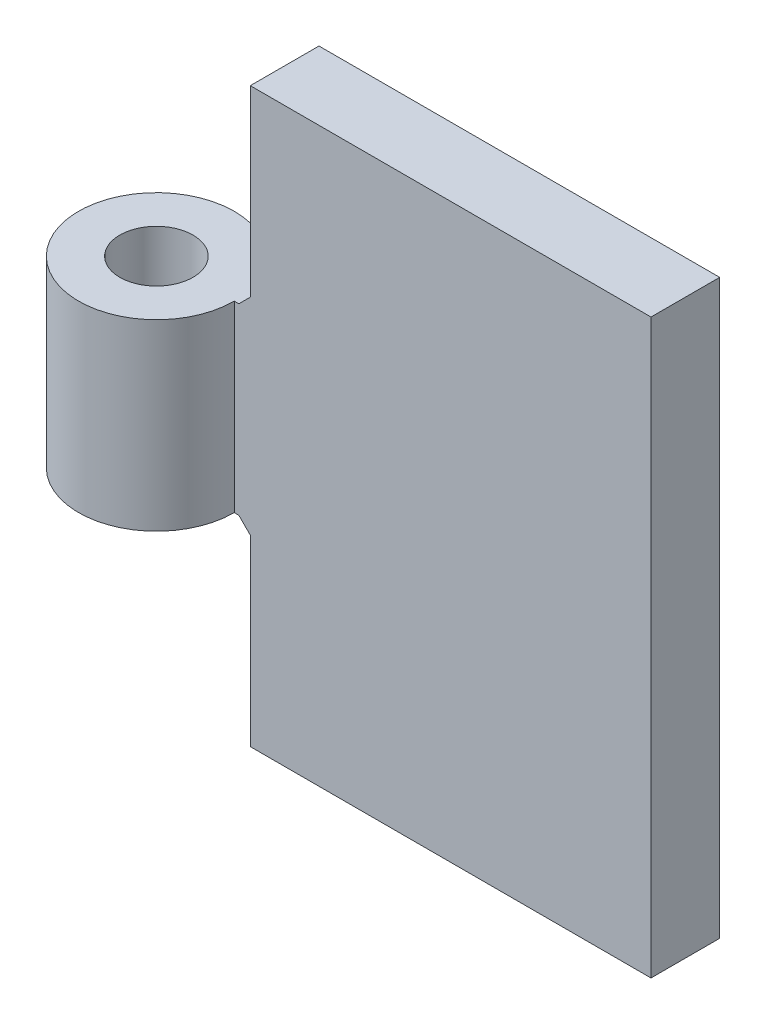
ISO-10303-21;
HEADER;
FILE_DESCRIPTION(('STEP AP214'),'2;1');
FILE_NAME('part.step','',(''),(''),'','','');
FILE_SCHEMA(('AUTOMOTIVE_DESIGN { 1 0 10303 214 1 1 1 1 }'));
ENDSEC;
DATA;
#1=APPLICATION_CONTEXT('core data for automotive mechanical design processes');
#2=APPLICATION_PROTOCOL_DEFINITION('international standard','automotive_design',2000,#1);
#3=PRODUCT_CONTEXT('',#1,'mechanical');
#4=PRODUCT('Part','Part','',(#3));
#5=PRODUCT_RELATED_PRODUCT_CATEGORY('part','',(#4));
#6=PRODUCT_DEFINITION_FORMATION('','',#4);
#7=PRODUCT_DEFINITION_CONTEXT('part definition',#1,'design');
#8=PRODUCT_DEFINITION('design','',#6,#7);
#9=PRODUCT_DEFINITION_SHAPE('','',#8);
#10=(LENGTH_UNIT() NAMED_UNIT(*) SI_UNIT(.MILLI.,.METRE.));
#11=(NAMED_UNIT(*) PLANE_ANGLE_UNIT() SI_UNIT($,.RADIAN.));
#12=(NAMED_UNIT(*) SI_UNIT($,.STERADIAN.) SOLID_ANGLE_UNIT());
#13=UNCERTAINTY_MEASURE_WITH_UNIT(LENGTH_MEASURE(1.E-05),#10,'distance_accuracy_value','');
#14=(GEOMETRIC_REPRESENTATION_CONTEXT(3) GLOBAL_UNCERTAINTY_ASSIGNED_CONTEXT((#13)) GLOBAL_UNIT_ASSIGNED_CONTEXT((#10,
#11,#12)) REPRESENTATION_CONTEXT('',''));
#15=CARTESIAN_POINT('',(0.,0.,0.));
#16=DIRECTION('',(0.,0.,1.));
#17=DIRECTION('',(1.,0.,0.));
#18=AXIS2_PLACEMENT_3D('',#15,#16,#17);
#19=CARTESIAN_POINT('',(-7.5,-4.5,3.));
#20=DIRECTION('',(0.707106781186547,0.707106781186547,0.));
#21=DIRECTION('',(0.,0.,-1.));
#22=AXIS2_PLACEMENT_3D('',#19,#20,#21);
#23=PLANE('',#22);
#24=DIRECTION('',(0.,0.,-1.));
#25=VECTOR('',#24,1.);
#26=CARTESIAN_POINT('',(-7.5,-4.5,3.));
#27=LINE('',#26,#25);
#28=CARTESIAN_POINT('',(-7.5,-4.5,3.));
#29=VERTEX_POINT('',#28);
#30=CARTESIAN_POINT('',(-7.5,-4.5,0.));
#31=VERTEX_POINT('',#30);
#32=EDGE_CURVE('E133',#29,#31,#27,.T.);
#33=ORIENTED_EDGE('',*,*,#32,.F.);
#34=DIRECTION('',(0.707106781186548,-0.707106781186548,0.));
#35=VECTOR('',#34,1.);
#36=CARTESIAN_POINT('',(-7.5,-4.5,3.));
#37=LINE('',#36,#35);
#38=CARTESIAN_POINT('',(-8.,-4.,3.));
#39=VERTEX_POINT('',#38);
#40=EDGE_CURVE('E61',#29,#39,#37,.F.);
#41=ORIENTED_EDGE('',*,*,#40,.T.);
#42=DIRECTION('',(0.,0.,1.));
#43=VECTOR('',#42,1.);
#44=CARTESIAN_POINT('',(-8.,-4.,3.));
#45=LINE('',#44,#43);
#46=CARTESIAN_POINT('',(-8.,-4.,0.));
#47=VERTEX_POINT('',#46);
#48=EDGE_CURVE('E187',#47,#39,#45,.T.);
#49=ORIENTED_EDGE('',*,*,#48,.F.);
#50=DIRECTION('',(-0.707106781186548,0.707106781186548,0.));
#51=VECTOR('',#50,1.);
#52=CARTESIAN_POINT('',(-6.,-6.,0.));
#53=LINE('',#52,#51);
#54=EDGE_CURVE('E13',#47,#31,#53,.F.);
#55=ORIENTED_EDGE('',*,*,#54,.T.);
#56=EDGE_LOOP('',(#33,#41,#49,#55));
#57=FACE_BOUND('',#56,.T.);
#58=ADVANCED_FACE('F52',(#57),#23,.F.);
#59=CARTESIAN_POINT('',(-7.5,4.5,3.));
#60=DIRECTION('',(0.707106781186547,-0.707106781186547,0.));
#61=DIRECTION('',(0.,0.,1.));
#62=AXIS2_PLACEMENT_3D('',#59,#60,#61);
#63=PLANE('',#62);
#64=DIRECTION('',(0.,0.,1.));
#65=VECTOR('',#64,1.);
#66=CARTESIAN_POINT('',(-7.5,4.5,3.));
#67=LINE('',#66,#65);
#68=CARTESIAN_POINT('',(-7.5,4.5,0.));
#69=VERTEX_POINT('',#68);
#70=CARTESIAN_POINT('',(-7.5,4.5,3.));
#71=VERTEX_POINT('',#70);
#72=EDGE_CURVE('E171',#69,#71,#67,.T.);
#73=ORIENTED_EDGE('',*,*,#72,.F.);
#74=DIRECTION('',(0.707106781186548,0.707106781186548,0.));
#75=VECTOR('',#74,1.);
#76=CARTESIAN_POINT('',(-6.,6.,0.));
#77=LINE('',#76,#75);
#78=CARTESIAN_POINT('',(-8.,4.,0.));
#79=VERTEX_POINT('',#78);
#80=EDGE_CURVE('E179',#69,#79,#77,.F.);
#81=ORIENTED_EDGE('',*,*,#80,.T.);
#82=DIRECTION('',(0.,0.,-1.));
#83=VECTOR('',#82,1.);
#84=CARTESIAN_POINT('',(-8.,4.,3.));
#85=LINE('',#84,#83);
#86=CARTESIAN_POINT('',(-8.,4.,3.));
#87=VERTEX_POINT('',#86);
#88=EDGE_CURVE('E175',#87,#79,#85,.T.);
#89=ORIENTED_EDGE('',*,*,#88,.F.);
#90=DIRECTION('',(-0.707106781186548,-0.707106781186548,0.));
#91=VECTOR('',#90,1.);
#92=CARTESIAN_POINT('',(-7.5,4.5,3.));
#93=LINE('',#92,#91);
#94=EDGE_CURVE('E182',#87,#71,#93,.F.);
#95=ORIENTED_EDGE('',*,*,#94,.T.);
#96=EDGE_LOOP('',(#73,#81,#89,#95));
#97=FACE_BOUND('',#96,.T.);
#98=ADVANCED_FACE('F269',(#97),#63,.F.);
#99=CARTESIAN_POINT('',(0.,0.,3.));
#100=DIRECTION('',(0.,0.,1.));
#101=DIRECTION('',(1.,0.,0.));
#102=AXIS2_PLACEMENT_3D('',#99,#100,#101);
#103=PLANE('',#102);
#104=ORIENTED_EDGE('',*,*,#40,.F.);
#105=DIRECTION('',(0.,-1.,0.));
#106=VECTOR('',#105,1.);
#107=CARTESIAN_POINT('',(-7.5,-0.0948751620466724,3.));
#108=LINE('',#107,#106);
#109=CARTESIAN_POINT('',(-7.5,-12.5,3.));
#110=VERTEX_POINT('',#109);
#111=EDGE_CURVE('E145',#29,#110,#108,.T.);
#112=ORIENTED_EDGE('',*,*,#111,.T.);
#113=DIRECTION('',(1.,0.,0.));
#114=VECTOR('',#113,1.);
#115=CARTESIAN_POINT('',(-10.,-12.5,3.));
#116=LINE('',#115,#114);
#117=CARTESIAN_POINT('',(10.,-12.5,3.));
#118=VERTEX_POINT('',#117);
#119=EDGE_CURVE('E143',#110,#118,#116,.T.);
#120=ORIENTED_EDGE('',*,*,#119,.T.);
#121=DIRECTION('',(0.,1.,0.));
#122=VECTOR('',#121,1.);
#123=CARTESIAN_POINT('',(10.,-12.5,3.));
#124=LINE('',#123,#122);
#125=CARTESIAN_POINT('',(10.,12.5,3.));
#126=VERTEX_POINT('',#125);
#127=EDGE_CURVE('E168',#118,#126,#124,.T.);
#128=ORIENTED_EDGE('',*,*,#127,.T.);
#129=DIRECTION('',(-1.,0.,0.));
#130=VECTOR('',#129,1.);
#131=CARTESIAN_POINT('',(-10.,12.5,3.));
#132=LINE('',#131,#130);
#133=CARTESIAN_POINT('',(-7.5,12.5,3.));
#134=VERTEX_POINT('',#133);
#135=EDGE_CURVE('E156',#126,#134,#132,.T.);
#136=ORIENTED_EDGE('',*,*,#135,.T.);
#137=DIRECTION('',(0.,1.,0.));
#138=VECTOR('',#137,1.);
#139=CARTESIAN_POINT('',(-7.5,0.0948751620466724,3.));
#140=LINE('',#139,#138);
#141=EDGE_CURVE('E233',#71,#134,#140,.T.);
#142=ORIENTED_EDGE('',*,*,#141,.F.);
#143=ORIENTED_EDGE('',*,*,#94,.F.);
#144=DIRECTION('',(-1.,0.,0.));
#145=VECTOR('',#144,1.);
#146=CARTESIAN_POINT('',(-10.,4.,3.));
#147=LINE('',#146,#145);
#148=CARTESIAN_POINT('',(-8.19999999999999,4.,3.));
#149=VERTEX_POINT('',#148);
#150=EDGE_CURVE('E226',#87,#149,#147,.T.);
#151=ORIENTED_EDGE('',*,*,#150,.T.);
#152=DIRECTION('',(0.,1.,0.));
#153=VECTOR('',#152,1.);
#154=CARTESIAN_POINT('',(-8.19999999999999,-4.,3.));
#155=LINE('',#154,#153);
#156=CARTESIAN_POINT('',(-8.19999999999999,-4.,3.));
#157=VERTEX_POINT('',#156);
#158=EDGE_CURVE('E201',#157,#149,#155,.T.);
#159=ORIENTED_EDGE('',*,*,#158,.F.);
#160=DIRECTION('',(1.,0.,0.));
#161=VECTOR('',#160,1.);
#162=CARTESIAN_POINT('',(-10.,-4.,3.));
#163=LINE('',#162,#161);
#164=EDGE_CURVE('E243',#157,#39,#163,.T.);
#165=ORIENTED_EDGE('',*,*,#164,.T.);
#166=EDGE_LOOP('',(#104,#112,#120,#128,#136,#142,#143,#151,#159,#165));
#167=FACE_BOUND('',#166,.T.);
#168=ADVANCED_FACE('F253',(#167),#103,.T.);
#169=CARTESIAN_POINT('',(-10.,-12.5,3.));
#170=DIRECTION('',(0.,1.,0.));
#171=DIRECTION('',(0.,0.,1.));
#172=AXIS2_PLACEMENT_3D('',#169,#170,#171);
#173=PLANE('',#172);
#174=DIRECTION('',(0.,0.,-1.));
#175=VECTOR('',#174,1.);
#176=CARTESIAN_POINT('',(-7.5,-12.5,3.));
#177=LINE('',#176,#175);
#178=CARTESIAN_POINT('',(-7.5,-12.5,0.));
#179=VERTEX_POINT('',#178);
#180=EDGE_CURVE('E131',#110,#179,#177,.T.);
#181=ORIENTED_EDGE('',*,*,#180,.T.);
#182=DIRECTION('',(1.,0.,0.));
#183=VECTOR('',#182,1.);
#184=CARTESIAN_POINT('',(-10.,-12.5,0.));
#185=LINE('',#184,#183);
#186=CARTESIAN_POINT('',(10.,-12.5,0.));
#187=VERTEX_POINT('',#186);
#188=EDGE_CURVE('E141',#179,#187,#185,.T.);
#189=ORIENTED_EDGE('',*,*,#188,.T.);
#190=DIRECTION('',(0.,0.,-1.));
#191=VECTOR('',#190,1.);
#192=CARTESIAN_POINT('',(10.,-12.5,3.));
#193=LINE('',#192,#191);
#194=EDGE_CURVE('E167',#118,#187,#193,.T.);
#195=ORIENTED_EDGE('',*,*,#194,.F.);
#196=ORIENTED_EDGE('',*,*,#119,.F.);
#197=EDGE_LOOP('',(#181,#189,#195,#196));
#198=FACE_BOUND('',#197,.T.);
#199=ADVANCED_FACE('F139',(#198),#173,.F.);
#200=CARTESIAN_POINT('',(0.,0.,0.));
#201=DIRECTION('',(0.,0.,1.));
#202=DIRECTION('',(1.,0.,0.));
#203=AXIS2_PLACEMENT_3D('',#200,#201,#202);
#204=PLANE('',#203);
#205=ORIENTED_EDGE('',*,*,#54,.F.);
#206=DIRECTION('',(-1.,0.,0.));
#207=VECTOR('',#206,1.);
#208=CARTESIAN_POINT('',(-10.,-4.,0.));
#209=LINE('',#208,#207);
#210=CARTESIAN_POINT('',(-10.,-4.,0.));
#211=VERTEX_POINT('',#210);
#212=EDGE_CURVE('E136',#47,#211,#209,.T.);
#213=ORIENTED_EDGE('',*,*,#212,.T.);
#214=DIRECTION('',(0.,-1.,0.));
#215=VECTOR('',#214,1.);
#216=CARTESIAN_POINT('',(-10.,-12.5,0.));
#217=LINE('',#216,#215);
#218=CARTESIAN_POINT('',(-10.,4.,0.));
#219=VERTEX_POINT('',#218);
#220=EDGE_CURVE('E152',#219,#211,#217,.T.);
#221=ORIENTED_EDGE('',*,*,#220,.F.);
#222=DIRECTION('',(1.,0.,0.));
#223=VECTOR('',#222,1.);
#224=CARTESIAN_POINT('',(-10.,4.,0.));
#225=LINE('',#224,#223);
#226=EDGE_CURVE('E232',#219,#79,#225,.T.);
#227=ORIENTED_EDGE('',*,*,#226,.T.);
#228=ORIENTED_EDGE('',*,*,#80,.F.);
#229=DIRECTION('',(0.,1.,0.));
#230=VECTOR('',#229,1.);
#231=CARTESIAN_POINT('',(-7.5,0.0948751620466724,0.));
#232=LINE('',#231,#230);
#233=CARTESIAN_POINT('',(-7.5,12.5,0.));
#234=VERTEX_POINT('',#233);
#235=EDGE_CURVE('E236',#69,#234,#232,.T.);
#236=ORIENTED_EDGE('',*,*,#235,.T.);
#237=DIRECTION('',(-1.,0.,0.));
#238=VECTOR('',#237,1.);
#239=CARTESIAN_POINT('',(-10.,12.5,0.));
#240=LINE('',#239,#238);
#241=CARTESIAN_POINT('',(10.,12.5,0.));
#242=VERTEX_POINT('',#241);
#243=EDGE_CURVE('E159',#242,#234,#240,.T.);
#244=ORIENTED_EDGE('',*,*,#243,.F.);
#245=DIRECTION('',(0.,1.,0.));
#246=VECTOR('',#245,1.);
#247=CARTESIAN_POINT('',(10.,-12.5,0.));
#248=LINE('',#247,#246);
#249=EDGE_CURVE('E150',#187,#242,#248,.T.);
#250=ORIENTED_EDGE('',*,*,#249,.F.);
#251=ORIENTED_EDGE('',*,*,#188,.F.);
#252=DIRECTION('',(0.,-1.,0.));
#253=VECTOR('',#252,1.);
#254=CARTESIAN_POINT('',(-7.5,-0.0948751620466724,0.));
#255=LINE('',#254,#253);
#256=EDGE_CURVE('E127',#31,#179,#255,.T.);
#257=ORIENTED_EDGE('',*,*,#256,.F.);
#258=EDGE_LOOP('',(#205,#213,#221,#227,#228,#236,#244,#250,#251,#257));
#259=FACE_BOUND('',#258,.T.);
#260=ADVANCED_FACE('F148',(#259),#204,.F.);
#261=CARTESIAN_POINT('',(-10.,12.5,3.));
#262=DIRECTION('',(0.,-1.,0.));
#263=DIRECTION('',(0.,0.,-1.));
#264=AXIS2_PLACEMENT_3D('',#261,#262,#263);
#265=PLANE('',#264);
#266=ORIENTED_EDGE('',*,*,#243,.T.);
#267=DIRECTION('',(0.,0.,-1.));
#268=VECTOR('',#267,1.);
#269=CARTESIAN_POINT('',(-7.5,12.5,3.));
#270=LINE('',#269,#268);
#271=EDGE_CURVE('E237',#134,#234,#270,.T.);
#272=ORIENTED_EDGE('',*,*,#271,.F.);
#273=ORIENTED_EDGE('',*,*,#135,.F.);
#274=DIRECTION('',(0.,0.,-1.));
#275=VECTOR('',#274,1.);
#276=CARTESIAN_POINT('',(10.,12.5,3.));
#277=LINE('',#276,#275);
#278=EDGE_CURVE('E163',#126,#242,#277,.T.);
#279=ORIENTED_EDGE('',*,*,#278,.T.);
#280=EDGE_LOOP('',(#266,#272,#273,#279));
#281=FACE_BOUND('',#280,.T.);
#282=ADVANCED_FACE('F261',(#281),#265,.F.);
#283=CARTESIAN_POINT('',(10.,-12.5,3.));
#284=DIRECTION('',(-1.,0.,0.));
#285=DIRECTION('',(0.,0.,1.));
#286=AXIS2_PLACEMENT_3D('',#283,#284,#285);
#287=PLANE('',#286);
#288=ORIENTED_EDGE('',*,*,#249,.T.);
#289=ORIENTED_EDGE('',*,*,#278,.F.);
#290=ORIENTED_EDGE('',*,*,#127,.F.);
#291=ORIENTED_EDGE('',*,*,#194,.T.);
#292=EDGE_LOOP('',(#288,#289,#290,#291));
#293=FACE_BOUND('',#292,.T.);
#294=ADVANCED_FACE('F260',(#293),#287,.F.);
#295=CARTESIAN_POINT('',(-11.6,-4.,3.));
#296=DIRECTION('',(0.,1.,0.));
#297=DIRECTION('',(0.,0.,1.));
#298=AXIS2_PLACEMENT_3D('',#295,#296,#297);
#299=PLANE('',#298);
#300=CARTESIAN_POINT('',(-11.6,-4.,3.));
#301=DIRECTION('',(0.,1.,0.));
#302=DIRECTION('',(0.,0.,1.));
#303=AXIS2_PLACEMENT_3D('',#300,#301,#302);
#304=CIRCLE('',#303,1.60000000000001);
#305=CARTESIAN_POINT('',(-11.6,-4.,4.6));
#306=VERTEX_POINT('',#305);
#307=EDGE_CURVE('E220',#306,#306,#304,.T.);
#308=ORIENTED_EDGE('',*,*,#307,.T.);
#309=EDGE_LOOP('',(#308));
#310=FACE_BOUND('',#309,.T.);
#311=ORIENTED_EDGE('',*,*,#212,.F.);
#312=ORIENTED_EDGE('',*,*,#48,.T.);
#313=ORIENTED_EDGE('',*,*,#164,.F.);
#314=CARTESIAN_POINT('',(-11.6,-4.,3.));
#315=DIRECTION('',(0.,1.,0.));
#316=DIRECTION('',(0.,0.,1.));
#317=AXIS2_PLACEMENT_3D('',#314,#315,#316);
#318=CIRCLE('',#317,3.4);
#319=EDGE_CURVE('E209',#211,#157,#318,.T.);
#320=ORIENTED_EDGE('',*,*,#319,.F.);
#321=EDGE_LOOP('',(#311,#312,#313,#320));
#322=FACE_BOUND('',#321,.T.);
#323=ADVANCED_FACE('F256',(#310,#322),#299,.F.);
#324=CARTESIAN_POINT('',(-11.6,4.,3.));
#325=DIRECTION('',(0.,1.,0.));
#326=DIRECTION('',(0.,0.,1.));
#327=AXIS2_PLACEMENT_3D('',#324,#325,#326);
#328=PLANE('',#327);
#329=CARTESIAN_POINT('',(-11.6,4.,3.));
#330=DIRECTION('',(0.,1.,0.));
#331=DIRECTION('',(0.,0.,1.));
#332=AXIS2_PLACEMENT_3D('',#329,#330,#331);
#333=CIRCLE('',#332,1.60000000000001);
#334=CARTESIAN_POINT('',(-11.6,4.,4.6));
#335=VERTEX_POINT('',#334);
#336=EDGE_CURVE('E222',#335,#335,#333,.T.);
#337=ORIENTED_EDGE('',*,*,#336,.F.);
#338=EDGE_LOOP('',(#337));
#339=FACE_BOUND('',#338,.T.);
#340=ORIENTED_EDGE('',*,*,#150,.F.);
#341=ORIENTED_EDGE('',*,*,#88,.T.);
#342=ORIENTED_EDGE('',*,*,#226,.F.);
#343=CARTESIAN_POINT('',(-11.6,4.,3.));
#344=DIRECTION('',(0.,1.,0.));
#345=DIRECTION('',(0.,0.,1.));
#346=AXIS2_PLACEMENT_3D('',#343,#344,#345);
#347=CIRCLE('',#346,3.4);
#348=EDGE_CURVE('E216',#219,#149,#347,.T.);
#349=ORIENTED_EDGE('',*,*,#348,.T.);
#350=EDGE_LOOP('',(#340,#341,#342,#349));
#351=FACE_BOUND('',#350,.T.);
#352=ADVANCED_FACE('F271',(#339,#351),#328,.T.);
#353=CARTESIAN_POINT('',(-11.6,-4.,3.));
#354=DIRECTION('',(0.,1.,0.));
#355=DIRECTION('',(0.,0.,1.));
#356=AXIS2_PLACEMENT_3D('',#353,#354,#355);
#357=CYLINDRICAL_SURFACE('',#356,3.4);
#358=ORIENTED_EDGE('',*,*,#319,.T.);
#359=ORIENTED_EDGE('',*,*,#158,.T.);
#360=ORIENTED_EDGE('',*,*,#348,.F.);
#361=ORIENTED_EDGE('',*,*,#220,.T.);
#362=EDGE_LOOP('',(#358,#359,#360,#361));
#363=FACE_BOUND('',#362,.T.);
#364=ADVANCED_FACE('F273',(#363),#357,.T.);
#365=CARTESIAN_POINT('',(-11.6,-4.,3.));
#366=DIRECTION('',(0.,1.,0.));
#367=DIRECTION('',(0.,0.,1.));
#368=AXIS2_PLACEMENT_3D('',#365,#366,#367);
#369=CYLINDRICAL_SURFACE('',#368,1.60000000000001);
#370=ORIENTED_EDGE('',*,*,#336,.T.);
#371=EDGE_LOOP('',(#370));
#372=FACE_BOUND('',#371,.T.);
#373=ORIENTED_EDGE('',*,*,#307,.F.);
#374=EDGE_LOOP('',(#373));
#375=FACE_BOUND('',#374,.T.);
#376=ADVANCED_FACE('F275',(#372,#375),#369,.F.);
#377=CARTESIAN_POINT('',(-7.5,0.0948751620466724,3.));
#378=DIRECTION('',(1.,0.,0.));
#379=DIRECTION('',(0.,0.,-1.));
#380=AXIS2_PLACEMENT_3D('',#377,#378,#379);
#381=PLANE('',#380);
#382=ORIENTED_EDGE('',*,*,#235,.F.);
#383=ORIENTED_EDGE('',*,*,#72,.T.);
#384=ORIENTED_EDGE('',*,*,#141,.T.);
#385=ORIENTED_EDGE('',*,*,#271,.T.);
#386=EDGE_LOOP('',(#382,#383,#384,#385));
#387=FACE_BOUND('',#386,.T.);
#388=ADVANCED_FACE('F264',(#387),#381,.F.);
#389=CARTESIAN_POINT('',(-7.5,-0.0948751620466724,3.));
#390=DIRECTION('',(-1.,0.,0.));
#391=DIRECTION('',(0.,0.,1.));
#392=AXIS2_PLACEMENT_3D('',#389,#390,#391);
#393=PLANE('',#392);
#394=ORIENTED_EDGE('',*,*,#111,.F.);
#395=ORIENTED_EDGE('',*,*,#32,.T.);
#396=ORIENTED_EDGE('',*,*,#256,.T.);
#397=ORIENTED_EDGE('',*,*,#180,.F.);
#398=EDGE_LOOP('',(#394,#395,#396,#397));
#399=FACE_BOUND('',#398,.T.);
#400=ADVANCED_FACE('F130',(#399),#393,.T.);
#401=CLOSED_SHELL('',(#58,#98,#168,#199,#260,#282,#294,#323,#352,#364,#376,#388,#400));
#402=MANIFOLD_SOLID_BREP('B2',#401);
#403=ADVANCED_BREP_SHAPE_REPRESENTATION('',(#18,#402),#14);
#404=SHAPE_DEFINITION_REPRESENTATION(#9,#403);
ENDSEC;
END-ISO-10303-21;
